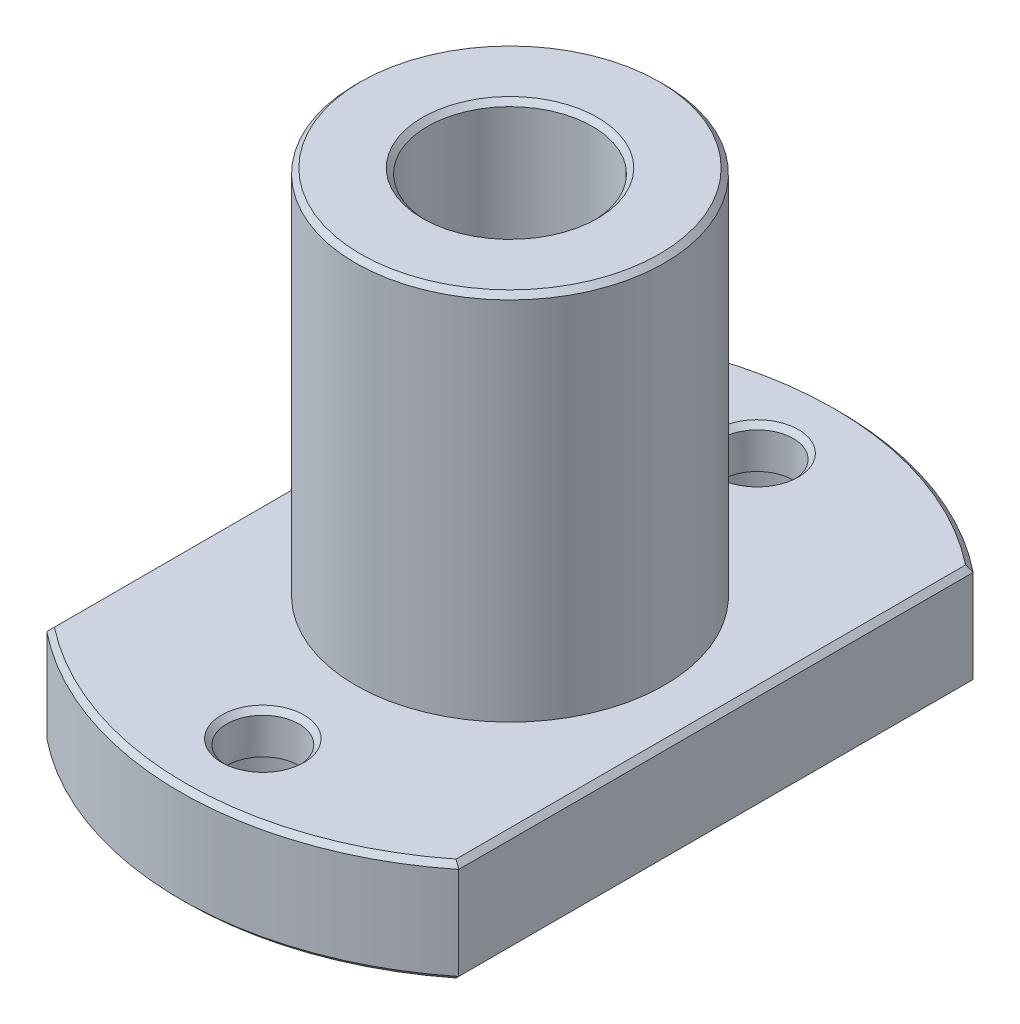
ISO-10303-21;
HEADER;
FILE_DESCRIPTION(('STEP AP214'),'2;1');
FILE_NAME('part.step','',(''),(''),'','','');
FILE_SCHEMA(('AUTOMOTIVE_DESIGN { 1 0 10303 214 1 1 1 1 }'));
ENDSEC;
DATA;
#1=APPLICATION_CONTEXT('core data for automotive mechanical design processes');
#2=APPLICATION_PROTOCOL_DEFINITION('international standard','automotive_design',2000,#1);
#3=PRODUCT_CONTEXT('',#1,'mechanical');
#4=PRODUCT('Part','Part','',(#3));
#5=PRODUCT_RELATED_PRODUCT_CATEGORY('part','',(#4));
#6=PRODUCT_DEFINITION_FORMATION('','',#4);
#7=PRODUCT_DEFINITION_CONTEXT('part definition',#1,'design');
#8=PRODUCT_DEFINITION('design','',#6,#7);
#9=PRODUCT_DEFINITION_SHAPE('','',#8);
#10=(LENGTH_UNIT() NAMED_UNIT(*) SI_UNIT(.MILLI.,.METRE.));
#11=(NAMED_UNIT(*) PLANE_ANGLE_UNIT() SI_UNIT($,.RADIAN.));
#12=(NAMED_UNIT(*) SI_UNIT($,.STERADIAN.) SOLID_ANGLE_UNIT());
#13=UNCERTAINTY_MEASURE_WITH_UNIT(LENGTH_MEASURE(1.E-05),#10,'distance_accuracy_value','');
#14=(GEOMETRIC_REPRESENTATION_CONTEXT(3) GLOBAL_UNCERTAINTY_ASSIGNED_CONTEXT((#13)) GLOBAL_UNIT_ASSIGNED_CONTEXT((#10,
#11,#12)) REPRESENTATION_CONTEXT('',''));
#15=CARTESIAN_POINT('',(0.,0.,0.));
#16=DIRECTION('',(0.,0.,1.));
#17=DIRECTION('',(1.,0.,0.));
#18=AXIS2_PLACEMENT_3D('',#15,#16,#17);
#19=CARTESIAN_POINT('',(0.,0.,-12.));
#20=DIRECTION('',(0.,1.,0.));
#21=DIRECTION('',(0.,0.,1.));
#22=AXIS2_PLACEMENT_3D('',#19,#20,#21);
#23=CYLINDRICAL_SURFACE('',#22,1.75);
#24=CARTESIAN_POINT('',(0.,4.74999999999999,-12.));
#25=DIRECTION('',(0.,1.,0.));
#26=DIRECTION('',(0.,0.,1.));
#27=AXIS2_PLACEMENT_3D('',#24,#25,#26);
#28=CIRCLE('',#27,1.75);
#29=CARTESIAN_POINT('',(0.,4.74999999999999,-10.25));
#30=VERTEX_POINT('',#29);
#31=EDGE_CURVE('E127',#30,#30,#28,.T.);
#32=ORIENTED_EDGE('',*,*,#31,.T.);
#33=EDGE_LOOP('',(#32));
#34=FACE_BOUND('',#33,.T.);
#35=CARTESIAN_POINT('',(0.,3.,-12.));
#36=DIRECTION('',(0.,-1.,0.));
#37=DIRECTION('',(0.,0.,-1.));
#38=AXIS2_PLACEMENT_3D('',#35,#36,#37);
#39=CIRCLE('',#38,1.75);
#40=CARTESIAN_POINT('',(0.,3.,-13.75));
#41=VERTEX_POINT('',#40);
#42=EDGE_CURVE('E279',#41,#41,#39,.F.);
#43=ORIENTED_EDGE('',*,*,#42,.F.);
#44=EDGE_LOOP('',(#43));
#45=FACE_BOUND('',#44,.T.);
#46=ADVANCED_FACE('F35',(#34,#45),#23,.F.);
#47=CARTESIAN_POINT('',(0.,0.,12.));
#48=DIRECTION('',(0.,1.,0.));
#49=DIRECTION('',(0.,0.,1.));
#50=AXIS2_PLACEMENT_3D('',#47,#48,#49);
#51=CYLINDRICAL_SURFACE('',#50,1.75);
#52=CARTESIAN_POINT('',(0.,4.74999999999998,12.));
#53=DIRECTION('',(0.,1.,0.));
#54=DIRECTION('',(0.,0.,1.));
#55=AXIS2_PLACEMENT_3D('',#52,#53,#54);
#56=CIRCLE('',#55,1.75);
#57=CARTESIAN_POINT('',(0.,4.74999999999998,13.75));
#58=VERTEX_POINT('',#57);
#59=EDGE_CURVE('E144',#58,#58,#56,.T.);
#60=ORIENTED_EDGE('',*,*,#59,.T.);
#61=EDGE_LOOP('',(#60));
#62=FACE_BOUND('',#61,.T.);
#63=CARTESIAN_POINT('',(0.,3.,12.));
#64=DIRECTION('',(0.,-1.,0.));
#65=DIRECTION('',(0.,0.,-1.));
#66=AXIS2_PLACEMENT_3D('',#63,#64,#65);
#67=CIRCLE('',#66,1.75);
#68=CARTESIAN_POINT('',(0.,3.,10.25));
#69=VERTEX_POINT('',#68);
#70=EDGE_CURVE('E275',#69,#69,#67,.F.);
#71=ORIENTED_EDGE('',*,*,#70,.F.);
#72=EDGE_LOOP('',(#71));
#73=FACE_BOUND('',#72,.T.);
#74=ADVANCED_FACE('F324',(#62,#73),#51,.F.);
#75=CARTESIAN_POINT('',(0.,5.,0.));
#76=DIRECTION('',(0.,-1.,0.));
#77=DIRECTION('',(0.,0.,-1.));
#78=AXIS2_PLACEMENT_3D('',#75,#76,#77);
#79=CYLINDRICAL_SURFACE('',#78,16.);
#80=DIRECTION('',(0.,-1.,0.));
#81=VECTOR('',#80,1.);
#82=CARTESIAN_POINT('',(-10.,5.,12.4899959967968));
#83=LINE('',#82,#81);
#84=CARTESIAN_POINT('',(-10.,4.74999999999999,12.4899959967968));
#85=VERTEX_POINT('',#84);
#86=CARTESIAN_POINT('',(-10.,0.250000000000004,12.4899959967968));
#87=VERTEX_POINT('',#86);
#88=EDGE_CURVE('E267',#85,#87,#83,.T.);
#89=ORIENTED_EDGE('',*,*,#88,.T.);
#90=CARTESIAN_POINT('',(0.,0.250000000000004,0.));
#91=DIRECTION('',(0.,1.,0.));
#92=DIRECTION('',(0.,0.,1.));
#93=AXIS2_PLACEMENT_3D('',#90,#91,#92);
#94=CIRCLE('',#93,16.);
#95=CARTESIAN_POINT('',(10.,0.250000000000004,12.4899959967968));
#96=VERTEX_POINT('',#95);
#97=EDGE_CURVE('E180',#87,#96,#94,.T.);
#98=ORIENTED_EDGE('',*,*,#97,.T.);
#99=DIRECTION('',(0.,-1.,0.));
#100=VECTOR('',#99,1.);
#101=CARTESIAN_POINT('',(10.,5.,12.4899959967968));
#102=LINE('',#101,#100);
#103=CARTESIAN_POINT('',(10.,4.74999999999999,12.4899959967968));
#104=VERTEX_POINT('',#103);
#105=EDGE_CURVE('E265',#104,#96,#102,.T.);
#106=ORIENTED_EDGE('',*,*,#105,.F.);
#107=CARTESIAN_POINT('',(0.,4.74999999999999,0.));
#108=DIRECTION('',(0.,1.,0.));
#109=DIRECTION('',(0.,0.,1.));
#110=AXIS2_PLACEMENT_3D('',#107,#108,#109);
#111=CIRCLE('',#110,16.);
#112=EDGE_CURVE('E62',#104,#85,#111,.F.);
#113=ORIENTED_EDGE('',*,*,#112,.T.);
#114=EDGE_LOOP('',(#89,#98,#106,#113));
#115=FACE_BOUND('',#114,.T.);
#116=ADVANCED_FACE('F296',(#115),#79,.T.);
#117=DIRECTION('',(0.,-1.,0.));
#118=VECTOR('',#117,1.);
#119=CARTESIAN_POINT('',(10.,5.,-12.4899959967968));
#120=LINE('',#119,#118);
#121=CARTESIAN_POINT('',(10.,4.74999999999999,-12.4899959967968));
#122=VERTEX_POINT('',#121);
#123=CARTESIAN_POINT('',(10.,0.250000000000004,-12.4899959967968));
#124=VERTEX_POINT('',#123);
#125=EDGE_CURVE('E261',#122,#124,#120,.T.);
#126=ORIENTED_EDGE('',*,*,#125,.T.);
#127=CARTESIAN_POINT('',(0.,0.250000000000004,0.));
#128=DIRECTION('',(0.,1.,0.));
#129=DIRECTION('',(0.,0.,1.));
#130=AXIS2_PLACEMENT_3D('',#127,#128,#129);
#131=CIRCLE('',#130,16.);
#132=CARTESIAN_POINT('',(-10.,0.250000000000004,-12.4899959967968));
#133=VERTEX_POINT('',#132);
#134=EDGE_CURVE('E177',#124,#133,#131,.T.);
#135=ORIENTED_EDGE('',*,*,#134,.T.);
#136=DIRECTION('',(0.,-1.,0.));
#137=VECTOR('',#136,1.);
#138=CARTESIAN_POINT('',(-10.,5.,-12.4899959967968));
#139=LINE('',#138,#137);
#140=CARTESIAN_POINT('',(-10.,4.74999999999999,-12.4899959967968));
#141=VERTEX_POINT('',#140);
#142=EDGE_CURVE('E262',#141,#133,#139,.T.);
#143=ORIENTED_EDGE('',*,*,#142,.F.);
#144=CARTESIAN_POINT('',(0.,4.74999999999999,0.));
#145=DIRECTION('',(0.,1.,0.));
#146=DIRECTION('',(0.,0.,1.));
#147=AXIS2_PLACEMENT_3D('',#144,#145,#146);
#148=CIRCLE('',#147,16.);
#149=EDGE_CURVE('E114',#141,#122,#148,.F.);
#150=ORIENTED_EDGE('',*,*,#149,.T.);
#151=EDGE_LOOP('',(#126,#135,#143,#150));
#152=FACE_BOUND('',#151,.T.);
#153=ADVANCED_FACE('F260',(#152),#79,.T.);
#154=CARTESIAN_POINT('',(0.,5.,0.));
#155=DIRECTION('',(0.,1.,0.));
#156=DIRECTION('',(0.,0.,1.));
#157=AXIS2_PLACEMENT_3D('',#154,#155,#156);
#158=PLANE('',#157);
#159=CARTESIAN_POINT('',(0.,5.,-12.));
#160=DIRECTION('',(0.,1.,0.));
#161=DIRECTION('',(0.,0.,1.));
#162=AXIS2_PLACEMENT_3D('',#159,#160,#161);
#163=CIRCLE('',#162,2.00000000000001);
#164=CARTESIAN_POINT('',(0.,5.,-9.99999999999999));
#165=VERTEX_POINT('',#164);
#166=EDGE_CURVE('E137',#165,#165,#163,.F.);
#167=ORIENTED_EDGE('',*,*,#166,.T.);
#168=EDGE_LOOP('',(#167));
#169=FACE_BOUND('',#168,.T.);
#170=CARTESIAN_POINT('',(0.,5.,12.));
#171=DIRECTION('',(0.,1.,0.));
#172=DIRECTION('',(0.,0.,1.));
#173=AXIS2_PLACEMENT_3D('',#170,#171,#172);
#174=CIRCLE('',#173,2.00000000000001);
#175=CARTESIAN_POINT('',(0.,5.,14.));
#176=VERTEX_POINT('',#175);
#177=EDGE_CURVE('E134',#176,#176,#174,.F.);
#178=ORIENTED_EDGE('',*,*,#177,.T.);
#179=EDGE_LOOP('',(#178));
#180=FACE_BOUND('',#179,.T.);
#181=DIRECTION('',(0.,0.,-1.));
#182=VECTOR('',#181,1.);
#183=CARTESIAN_POINT('',(9.74999999999999,5.,0.));
#184=LINE('',#183,#182);
#185=CARTESIAN_POINT('',(9.74999999999999,5.,12.369316876853));
#186=VERTEX_POINT('',#185);
#187=CARTESIAN_POINT('',(9.74999999999999,5.,-12.369316876853));
#188=VERTEX_POINT('',#187);
#189=EDGE_CURVE('E132',#186,#188,#184,.T.);
#190=ORIENTED_EDGE('',*,*,#189,.T.);
#191=CARTESIAN_POINT('',(0.,5.,0.));
#192=DIRECTION('',(0.,1.,0.));
#193=DIRECTION('',(0.,0.,1.));
#194=AXIS2_PLACEMENT_3D('',#191,#192,#193);
#195=CIRCLE('',#194,15.75);
#196=CARTESIAN_POINT('',(-9.74999999999999,5.,-12.369316876853));
#197=VERTEX_POINT('',#196);
#198=EDGE_CURVE('E112',#188,#197,#195,.T.);
#199=ORIENTED_EDGE('',*,*,#198,.T.);
#200=DIRECTION('',(0.,0.,1.));
#201=VECTOR('',#200,1.);
#202=CARTESIAN_POINT('',(-9.74999999999999,5.,0.));
#203=LINE('',#202,#201);
#204=CARTESIAN_POINT('',(-9.74999999999999,5.,12.369316876853));
#205=VERTEX_POINT('',#204);
#206=EDGE_CURVE('E120',#197,#205,#203,.T.);
#207=ORIENTED_EDGE('',*,*,#206,.T.);
#208=CARTESIAN_POINT('',(0.,5.,0.));
#209=DIRECTION('',(0.,1.,0.));
#210=DIRECTION('',(0.,0.,1.));
#211=AXIS2_PLACEMENT_3D('',#208,#209,#210);
#212=CIRCLE('',#211,15.75);
#213=EDGE_CURVE('E126',#205,#186,#212,.T.);
#214=ORIENTED_EDGE('',*,*,#213,.T.);
#215=EDGE_LOOP('',(#190,#199,#207,#214));
#216=FACE_BOUND('',#215,.T.);
#217=CARTESIAN_POINT('',(0.,5.,0.));
#218=DIRECTION('',(0.,1.,0.));
#219=DIRECTION('',(0.,0.,1.));
#220=AXIS2_PLACEMENT_3D('',#217,#218,#219);
#221=CIRCLE('',#220,7.5);
#222=CARTESIAN_POINT('',(0.,5.,7.5));
#223=VERTEX_POINT('',#222);
#224=EDGE_CURVE('E269',#223,#223,#221,.T.);
#225=ORIENTED_EDGE('',*,*,#224,.F.);
#226=EDGE_LOOP('',(#225));
#227=FACE_BOUND('',#226,.T.);
#228=ADVANCED_FACE('F129',(#169,#180,#216,#227),#158,.T.);
#229=CARTESIAN_POINT('',(0.,0.,0.));
#230=DIRECTION('',(0.,1.,0.));
#231=DIRECTION('',(0.,0.,1.));
#232=AXIS2_PLACEMENT_3D('',#229,#230,#231);
#233=PLANE('',#232);
#234=CARTESIAN_POINT('',(0.,0.,12.));
#235=DIRECTION('',(0.,1.,0.));
#236=DIRECTION('',(0.,0.,1.));
#237=AXIS2_PLACEMENT_3D('',#234,#235,#236);
#238=CIRCLE('',#237,3.25);
#239=CARTESIAN_POINT('',(0.,0.,15.25));
#240=VERTEX_POINT('',#239);
#241=EDGE_CURVE('E165',#240,#240,#238,.T.);
#242=ORIENTED_EDGE('',*,*,#241,.T.);
#243=EDGE_LOOP('',(#242));
#244=FACE_BOUND('',#243,.T.);
#245=CARTESIAN_POINT('',(0.,0.,0.));
#246=DIRECTION('',(0.,1.,0.));
#247=DIRECTION('',(0.,0.,1.));
#248=AXIS2_PLACEMENT_3D('',#245,#246,#247);
#249=CIRCLE('',#248,4.25);
#250=CARTESIAN_POINT('',(0.,0.,4.25));
#251=VERTEX_POINT('',#250);
#252=EDGE_CURVE('E162',#251,#251,#249,.T.);
#253=ORIENTED_EDGE('',*,*,#252,.T.);
#254=EDGE_LOOP('',(#253));
#255=FACE_BOUND('',#254,.T.);
#256=CARTESIAN_POINT('',(0.,0.,-12.));
#257=DIRECTION('',(0.,1.,0.));
#258=DIRECTION('',(0.,0.,1.));
#259=AXIS2_PLACEMENT_3D('',#256,#257,#258);
#260=CIRCLE('',#259,3.25);
#261=CARTESIAN_POINT('',(0.,0.,-8.75));
#262=VERTEX_POINT('',#261);
#263=EDGE_CURVE('E159',#262,#262,#260,.T.);
#264=ORIENTED_EDGE('',*,*,#263,.T.);
#265=EDGE_LOOP('',(#264));
#266=FACE_BOUND('',#265,.T.);
#267=CARTESIAN_POINT('',(0.,0.,0.));
#268=DIRECTION('',(0.,1.,0.));
#269=DIRECTION('',(0.,0.,1.));
#270=AXIS2_PLACEMENT_3D('',#267,#268,#269);
#271=CIRCLE('',#270,15.75);
#272=CARTESIAN_POINT('',(-9.75,0.,-12.369316876853));
#273=VERTEX_POINT('',#272);
#274=CARTESIAN_POINT('',(9.75,0.,-12.369316876853));
#275=VERTEX_POINT('',#274);
#276=EDGE_CURVE('E154',#273,#275,#271,.F.);
#277=ORIENTED_EDGE('',*,*,#276,.T.);
#278=DIRECTION('',(0.,0.,1.));
#279=VECTOR('',#278,1.);
#280=CARTESIAN_POINT('',(9.75,0.,12.4899959967968));
#281=LINE('',#280,#279);
#282=CARTESIAN_POINT('',(9.75,0.,12.369316876853));
#283=VERTEX_POINT('',#282);
#284=EDGE_CURVE('E156',#275,#283,#281,.T.);
#285=ORIENTED_EDGE('',*,*,#284,.T.);
#286=CARTESIAN_POINT('',(0.,0.,0.));
#287=DIRECTION('',(0.,1.,0.));
#288=DIRECTION('',(0.,0.,1.));
#289=AXIS2_PLACEMENT_3D('',#286,#287,#288);
#290=CIRCLE('',#289,15.75);
#291=CARTESIAN_POINT('',(-9.75,0.,12.369316876853));
#292=VERTEX_POINT('',#291);
#293=EDGE_CURVE('E152',#283,#292,#290,.F.);
#294=ORIENTED_EDGE('',*,*,#293,.T.);
#295=DIRECTION('',(0.,0.,-1.));
#296=VECTOR('',#295,1.);
#297=CARTESIAN_POINT('',(-9.75,0.,-12.4899959967968));
#298=LINE('',#297,#296);
#299=EDGE_CURVE('E150',#292,#273,#298,.T.);
#300=ORIENTED_EDGE('',*,*,#299,.T.);
#301=EDGE_LOOP('',(#277,#285,#294,#300));
#302=FACE_BOUND('',#301,.T.);
#303=ADVANCED_FACE('F310',(#244,#255,#266,#302),#233,.F.);
#304=CARTESIAN_POINT('',(-10.,5.,-12.4899959967968));
#305=DIRECTION('',(-1.,0.,0.));
#306=DIRECTION('',(0.,0.,1.));
#307=AXIS2_PLACEMENT_3D('',#304,#305,#306);
#308=PLANE('',#307);
#309=ORIENTED_EDGE('',*,*,#142,.T.);
#310=DIRECTION('',(0.,0.,1.));
#311=VECTOR('',#310,1.);
#312=CARTESIAN_POINT('',(-10.,0.250000000000004,12.4899959967968));
#313=LINE('',#312,#311);
#314=EDGE_CURVE('E48',#133,#87,#313,.T.);
#315=ORIENTED_EDGE('',*,*,#314,.T.);
#316=ORIENTED_EDGE('',*,*,#88,.F.);
#317=DIRECTION('',(0.,0.,-1.));
#318=VECTOR('',#317,1.);
#319=CARTESIAN_POINT('',(-10.,4.74999999999999,-12.4899959967968));
#320=LINE('',#319,#318);
#321=EDGE_CURVE('E182',#85,#141,#320,.T.);
#322=ORIENTED_EDGE('',*,*,#321,.T.);
#323=EDGE_LOOP('',(#309,#315,#316,#322));
#324=FACE_BOUND('',#323,.T.);
#325=ADVANCED_FACE('F294',(#324),#308,.T.);
#326=CARTESIAN_POINT('',(10.,5.,-12.4899959967968));
#327=DIRECTION('',(1.,0.,0.));
#328=DIRECTION('',(0.,0.,-1.));
#329=AXIS2_PLACEMENT_3D('',#326,#327,#328);
#330=PLANE('',#329);
#331=ORIENTED_EDGE('',*,*,#105,.T.);
#332=DIRECTION('',(0.,0.,-1.));
#333=VECTOR('',#332,1.);
#334=CARTESIAN_POINT('',(10.,0.250000000000004,-12.4899959967968));
#335=LINE('',#334,#333);
#336=EDGE_CURVE('E173',#96,#124,#335,.T.);
#337=ORIENTED_EDGE('',*,*,#336,.T.);
#338=ORIENTED_EDGE('',*,*,#125,.F.);
#339=DIRECTION('',(0.,0.,1.));
#340=VECTOR('',#339,1.);
#341=CARTESIAN_POINT('',(10.,4.74999999999999,-12.4899959967968));
#342=LINE('',#341,#340);
#343=EDGE_CURVE('E171',#122,#104,#342,.T.);
#344=ORIENTED_EDGE('',*,*,#343,.T.);
#345=EDGE_LOOP('',(#331,#337,#338,#344));
#346=FACE_BOUND('',#345,.T.);
#347=ADVANCED_FACE('F263',(#346),#330,.T.);
#348=CARTESIAN_POINT('',(0.,23.,0.));
#349=DIRECTION('',(0.,-1.,0.));
#350=DIRECTION('',(0.,0.,-1.));
#351=AXIS2_PLACEMENT_3D('',#348,#349,#350);
#352=CYLINDRICAL_SURFACE('',#351,7.5);
#353=CARTESIAN_POINT('',(0.,22.75,0.));
#354=DIRECTION('',(0.,1.,0.));
#355=DIRECTION('',(0.,0.,1.));
#356=AXIS2_PLACEMENT_3D('',#353,#354,#355);
#357=CIRCLE('',#356,7.5);
#358=CARTESIAN_POINT('',(0.,22.75,7.5));
#359=VERTEX_POINT('',#358);
#360=EDGE_CURVE('E11',#359,#359,#357,.F.);
#361=ORIENTED_EDGE('',*,*,#360,.T.);
#362=EDGE_LOOP('',(#361));
#363=FACE_BOUND('',#362,.T.);
#364=ORIENTED_EDGE('',*,*,#224,.T.);
#365=EDGE_LOOP('',(#364));
#366=FACE_BOUND('',#365,.T.);
#367=ADVANCED_FACE('F343',(#363,#366),#352,.T.);
#368=CARTESIAN_POINT('',(0.,23.,0.));
#369=DIRECTION('',(0.,1.,0.));
#370=DIRECTION('',(0.,0.,1.));
#371=AXIS2_PLACEMENT_3D('',#368,#369,#370);
#372=PLANE('',#371);
#373=CARTESIAN_POINT('',(0.,23.,0.));
#374=DIRECTION('',(0.,1.,0.));
#375=DIRECTION('',(0.,0.,1.));
#376=AXIS2_PLACEMENT_3D('',#373,#374,#375);
#377=CIRCLE('',#376,4.25000000000001);
#378=CARTESIAN_POINT('',(0.,23.,4.25000000000001));
#379=VERTEX_POINT('',#378);
#380=EDGE_CURVE('E290',#379,#379,#377,.F.);
#381=ORIENTED_EDGE('',*,*,#380,.T.);
#382=EDGE_LOOP('',(#381));
#383=FACE_BOUND('',#382,.T.);
#384=CARTESIAN_POINT('',(0.,23.,0.));
#385=DIRECTION('',(0.,1.,0.));
#386=DIRECTION('',(0.,0.,1.));
#387=AXIS2_PLACEMENT_3D('',#384,#385,#386);
#388=CIRCLE('',#387,7.25);
#389=CARTESIAN_POINT('',(0.,23.,7.25));
#390=VERTEX_POINT('',#389);
#391=EDGE_CURVE('E287',#390,#390,#388,.T.);
#392=ORIENTED_EDGE('',*,*,#391,.T.);
#393=EDGE_LOOP('',(#392));
#394=FACE_BOUND('',#393,.T.);
#395=ADVANCED_FACE('F339',(#383,#394),#372,.T.);
#396=CARTESIAN_POINT('',(0.,0.,0.));
#397=DIRECTION('',(0.,1.,0.));
#398=DIRECTION('',(0.,0.,1.));
#399=AXIS2_PLACEMENT_3D('',#396,#397,#398);
#400=CYLINDRICAL_SURFACE('',#399,4.);
#401=CARTESIAN_POINT('',(0.,22.75,0.));
#402=DIRECTION('',(0.,1.,0.));
#403=DIRECTION('',(0.,0.,1.));
#404=AXIS2_PLACEMENT_3D('',#401,#402,#403);
#405=CIRCLE('',#404,4.);
#406=CARTESIAN_POINT('',(0.,22.75,4.));
#407=VERTEX_POINT('',#406);
#408=EDGE_CURVE('E284',#407,#407,#405,.T.);
#409=ORIENTED_EDGE('',*,*,#408,.T.);
#410=EDGE_LOOP('',(#409));
#411=FACE_BOUND('',#410,.T.);
#412=CARTESIAN_POINT('',(0.,0.25,0.));
#413=DIRECTION('',(0.,1.,0.));
#414=DIRECTION('',(0.,0.,1.));
#415=AXIS2_PLACEMENT_3D('',#412,#413,#414);
#416=CIRCLE('',#415,4.);
#417=CARTESIAN_POINT('',(0.,0.25,4.));
#418=VERTEX_POINT('',#417);
#419=EDGE_CURVE('E274',#418,#418,#416,.F.);
#420=ORIENTED_EDGE('',*,*,#419,.T.);
#421=EDGE_LOOP('',(#420));
#422=FACE_BOUND('',#421,.T.);
#423=ADVANCED_FACE('F335',(#411,#422),#400,.F.);
#424=CARTESIAN_POINT('',(0.,3.,12.));
#425=DIRECTION('',(0.,-1.,0.));
#426=DIRECTION('',(0.,0.,-1.));
#427=AXIS2_PLACEMENT_3D('',#424,#425,#426);
#428=PLANE('',#427);
#429=CARTESIAN_POINT('',(0.,3.,12.));
#430=DIRECTION('',(0.,-1.,0.));
#431=DIRECTION('',(0.,0.,-1.));
#432=AXIS2_PLACEMENT_3D('',#429,#430,#431);
#433=CIRCLE('',#432,3.);
#434=CARTESIAN_POINT('',(0.,3.,9.));
#435=VERTEX_POINT('',#434);
#436=EDGE_CURVE('E278',#435,#435,#433,.T.);
#437=ORIENTED_EDGE('',*,*,#436,.T.);
#438=EDGE_LOOP('',(#437));
#439=FACE_BOUND('',#438,.T.);
#440=ORIENTED_EDGE('',*,*,#70,.T.);
#441=EDGE_LOOP('',(#440));
#442=FACE_BOUND('',#441,.T.);
#443=ADVANCED_FACE('F338',(#439,#442),#428,.T.);
#444=CARTESIAN_POINT('',(0.,3.,12.));
#445=DIRECTION('',(0.,-1.,0.));
#446=DIRECTION('',(0.,0.,-1.));
#447=AXIS2_PLACEMENT_3D('',#444,#445,#446);
#448=CYLINDRICAL_SURFACE('',#447,3.);
#449=CARTESIAN_POINT('',(0.,0.249999999999999,12.));
#450=DIRECTION('',(0.,1.,0.));
#451=DIRECTION('',(0.,0.,1.));
#452=AXIS2_PLACEMENT_3D('',#449,#450,#451);
#453=CIRCLE('',#452,3.);
#454=CARTESIAN_POINT('',(0.,0.249999999999999,15.));
#455=VERTEX_POINT('',#454);
#456=EDGE_CURVE('E147',#455,#455,#453,.F.);
#457=ORIENTED_EDGE('',*,*,#456,.T.);
#458=EDGE_LOOP('',(#457));
#459=FACE_BOUND('',#458,.T.);
#460=ORIENTED_EDGE('',*,*,#436,.F.);
#461=EDGE_LOOP('',(#460));
#462=FACE_BOUND('',#461,.T.);
#463=ADVANCED_FACE('F372',(#459,#462),#448,.F.);
#464=CARTESIAN_POINT('',(0.,3.,-12.));
#465=DIRECTION('',(0.,-1.,0.));
#466=DIRECTION('',(0.,0.,-1.));
#467=AXIS2_PLACEMENT_3D('',#464,#465,#466);
#468=PLANE('',#467);
#469=CARTESIAN_POINT('',(0.,3.,-12.));
#470=DIRECTION('',(0.,-1.,0.));
#471=DIRECTION('',(0.,0.,-1.));
#472=AXIS2_PLACEMENT_3D('',#469,#470,#471);
#473=CIRCLE('',#472,3.);
#474=CARTESIAN_POINT('',(0.,3.,-15.));
#475=VERTEX_POINT('',#474);
#476=EDGE_CURVE('E222',#475,#475,#473,.T.);
#477=ORIENTED_EDGE('',*,*,#476,.T.);
#478=EDGE_LOOP('',(#477));
#479=FACE_BOUND('',#478,.T.);
#480=ORIENTED_EDGE('',*,*,#42,.T.);
#481=EDGE_LOOP('',(#480));
#482=FACE_BOUND('',#481,.T.);
#483=ADVANCED_FACE('F380',(#479,#482),#468,.T.);
#484=CARTESIAN_POINT('',(0.,3.,-12.));
#485=DIRECTION('',(0.,-1.,0.));
#486=DIRECTION('',(0.,0.,-1.));
#487=AXIS2_PLACEMENT_3D('',#484,#485,#486);
#488=CYLINDRICAL_SURFACE('',#487,3.);
#489=CARTESIAN_POINT('',(0.,0.249999999999999,-12.));
#490=DIRECTION('',(0.,1.,0.));
#491=DIRECTION('',(0.,0.,1.));
#492=AXIS2_PLACEMENT_3D('',#489,#490,#491);
#493=CIRCLE('',#492,3.);
#494=CARTESIAN_POINT('',(0.,0.249999999999999,-9.));
#495=VERTEX_POINT('',#494);
#496=EDGE_CURVE('E168',#495,#495,#493,.F.);
#497=ORIENTED_EDGE('',*,*,#496,.T.);
#498=EDGE_LOOP('',(#497));
#499=FACE_BOUND('',#498,.T.);
#500=ORIENTED_EDGE('',*,*,#476,.F.);
#501=EDGE_LOOP('',(#500));
#502=FACE_BOUND('',#501,.T.);
#503=ADVANCED_FACE('F387',(#499,#502),#488,.F.);
#504=CARTESIAN_POINT('',(0.,22.75,0.));
#505=DIRECTION('',(0.,1.,0.));
#506=DIRECTION('',(0.,0.,1.));
#507=AXIS2_PLACEMENT_3D('',#504,#505,#506);
#508=CONICAL_SURFACE('',#507,4.,0.785398163397462);
#509=ORIENTED_EDGE('',*,*,#380,.F.);
#510=EDGE_LOOP('',(#509));
#511=FACE_BOUND('',#510,.T.);
#512=ORIENTED_EDGE('',*,*,#408,.F.);
#513=EDGE_LOOP('',(#512));
#514=FACE_BOUND('',#513,.T.);
#515=ADVANCED_FACE('F394',(#511,#514),#508,.F.);
#516=CARTESIAN_POINT('',(0.,4.74999999999999,-12.));
#517=DIRECTION('',(0.,1.,0.));
#518=DIRECTION('',(0.,0.,1.));
#519=AXIS2_PLACEMENT_3D('',#516,#517,#518);
#520=CONICAL_SURFACE('',#519,1.75,0.785398163397437);
#521=ORIENTED_EDGE('',*,*,#166,.F.);
#522=EDGE_LOOP('',(#521));
#523=FACE_BOUND('',#522,.T.);
#524=ORIENTED_EDGE('',*,*,#31,.F.);
#525=EDGE_LOOP('',(#524));
#526=FACE_BOUND('',#525,.T.);
#527=ADVANCED_FACE('F402',(#523,#526),#520,.F.);
#528=CARTESIAN_POINT('',(0.,4.74999999999998,12.));
#529=DIRECTION('',(0.,1.,0.));
#530=DIRECTION('',(0.,0.,1.));
#531=AXIS2_PLACEMENT_3D('',#528,#529,#530);
#532=CONICAL_SURFACE('',#531,1.75,0.785398163397437);
#533=ORIENTED_EDGE('',*,*,#177,.F.);
#534=EDGE_LOOP('',(#533));
#535=FACE_BOUND('',#534,.T.);
#536=ORIENTED_EDGE('',*,*,#59,.F.);
#537=EDGE_LOOP('',(#536));
#538=FACE_BOUND('',#537,.T.);
#539=ADVANCED_FACE('F410',(#535,#538),#532,.F.);
#540=CARTESIAN_POINT('',(0.,0.249999999999999,12.));
#541=DIRECTION('',(0.,-1.,0.));
#542=DIRECTION('',(0.,0.,-1.));
#543=AXIS2_PLACEMENT_3D('',#540,#541,#542);
#544=CONICAL_SURFACE('',#543,3.,0.785398163397451);
#545=ORIENTED_EDGE('',*,*,#241,.F.);
#546=EDGE_LOOP('',(#545));
#547=FACE_BOUND('',#546,.T.);
#548=ORIENTED_EDGE('',*,*,#456,.F.);
#549=EDGE_LOOP('',(#548));
#550=FACE_BOUND('',#549,.T.);
#551=ADVANCED_FACE('F418',(#547,#550),#544,.F.);
#552=CARTESIAN_POINT('',(0.,0.,0.));
#553=DIRECTION('',(0.,-1.,0.));
#554=DIRECTION('',(0.,0.,-1.));
#555=AXIS2_PLACEMENT_3D('',#552,#553,#554);
#556=CONICAL_SURFACE('',#555,4.25,0.785398163397441);
#557=ORIENTED_EDGE('',*,*,#419,.F.);
#558=EDGE_LOOP('',(#557));
#559=FACE_BOUND('',#558,.T.);
#560=ORIENTED_EDGE('',*,*,#252,.F.);
#561=EDGE_LOOP('',(#560));
#562=FACE_BOUND('',#561,.T.);
#563=ADVANCED_FACE('F426',(#559,#562),#556,.F.);
#564=CARTESIAN_POINT('',(0.,0.249999999999999,-12.));
#565=DIRECTION('',(0.,-1.,0.));
#566=DIRECTION('',(0.,0.,-1.));
#567=AXIS2_PLACEMENT_3D('',#564,#565,#566);
#568=CONICAL_SURFACE('',#567,3.,0.785398163397451);
#569=ORIENTED_EDGE('',*,*,#263,.F.);
#570=EDGE_LOOP('',(#569));
#571=FACE_BOUND('',#570,.T.);
#572=ORIENTED_EDGE('',*,*,#496,.F.);
#573=EDGE_LOOP('',(#572));
#574=FACE_BOUND('',#573,.T.);
#575=ADVANCED_FACE('F434',(#571,#574),#568,.F.);
#576=CARTESIAN_POINT('',(-9.75,0.,0.));
#577=DIRECTION('',(-0.707106781186547,-0.707106781186547,0.));
#578=DIRECTION('',(0.,0.,1.));
#579=AXIS2_PLACEMENT_3D('',#576,#577,#578);
#580=PLANE('',#579);
#581=CARTESIAN_POINT('',(-9.75,0.,12.369316876853));
#582=CARTESIAN_POINT('',(-9.79164555998661,0.041645559986615,12.3895175139398));
#583=CARTESIAN_POINT('',(-9.83330167340362,0.0833016734036281,12.4096744258553));
#584=CARTESIAN_POINT('',(-9.91663500673714,0.166635006737146,12.4499007991692));
#585=CARTESIAN_POINT('',(-9.95831222665346,0.208312226653467,12.4699702605683));
#586=CARTESIAN_POINT('',(-10.,0.250000000000004,12.4899959967968));
#587=B_SPLINE_CURVE_WITH_KNOTS('',3,(#581,#582,#583,#584,#585,#586),.UNSPECIFIED.,.F.,.F.,(4,2,
4),(0.,0.186791011592949,0.373582021566176),.UNSPECIFIED.);
#588=EDGE_CURVE('E223',#87,#292,#587,.F.);
#589=ORIENTED_EDGE('',*,*,#588,.F.);
#590=ORIENTED_EDGE('',*,*,#314,.F.);
#591=CARTESIAN_POINT('',(-10.,0.250000000000004,-12.4899959967968));
#592=CARTESIAN_POINT('',(-9.95831222665346,0.208312226653466,-12.4699702605683));
#593=CARTESIAN_POINT('',(-9.91663500673714,0.166635006737145,-12.4499007991692));
#594=CARTESIAN_POINT('',(-9.83330167340362,0.083301673403627,-12.4096744258553));
#595=CARTESIAN_POINT('',(-9.79164555998661,0.0416455599866143,-12.3895175139398));
#596=CARTESIAN_POINT('',(-9.75,0.,-12.369316876853));
#597=B_SPLINE_CURVE_WITH_KNOTS('',3,(#591,#592,#593,#594,#595,#596),.UNSPECIFIED.,.F.,.F.,(4,2,
4),(0.,0.186791009973226,0.373582021566176),.UNSPECIFIED.);
#598=EDGE_CURVE('E217',#273,#133,#597,.F.);
#599=ORIENTED_EDGE('',*,*,#598,.F.);
#600=ORIENTED_EDGE('',*,*,#299,.F.);
#601=EDGE_LOOP('',(#589,#590,#599,#600));
#602=FACE_BOUND('',#601,.T.);
#603=ADVANCED_FACE('F211',(#602),#580,.T.);
#604=CARTESIAN_POINT('',(0.,0.250000000000004,0.));
#605=DIRECTION('',(0.,1.,0.));
#606=DIRECTION('',(0.,0.,1.));
#607=AXIS2_PLACEMENT_3D('',#604,#605,#606);
#608=CONICAL_SURFACE('',#607,16.,0.785398163397448);
#609=ORIENTED_EDGE('',*,*,#598,.T.);
#610=ORIENTED_EDGE('',*,*,#134,.F.);
#611=CARTESIAN_POINT('',(10.,0.250000000000004,-12.4899959967968));
#612=CARTESIAN_POINT('',(9.95831222665346,0.208312226653466,-12.4699702605683));
#613=CARTESIAN_POINT('',(9.91663500673714,0.166635006737145,-12.4499007991692));
#614=CARTESIAN_POINT('',(9.83330167340362,0.083301673403627,-12.4096744258553));
#615=CARTESIAN_POINT('',(9.79164555998661,0.0416455599866143,-12.3895175139398));
#616=CARTESIAN_POINT('',(9.75,0.,-12.369316876853));
#617=B_SPLINE_CURVE_WITH_KNOTS('',3,(#611,#612,#613,#614,#615,#616),.UNSPECIFIED.,.F.,.F.,(4,2,
4),(0.,0.186791009973226,0.373582021566176),.UNSPECIFIED.);
#618=EDGE_CURVE('E192',#275,#124,#617,.F.);
#619=ORIENTED_EDGE('',*,*,#618,.F.);
#620=ORIENTED_EDGE('',*,*,#276,.F.);
#621=EDGE_LOOP('',(#609,#610,#619,#620));
#622=FACE_BOUND('',#621,.T.);
#623=ADVANCED_FACE('F206',(#622),#608,.T.);
#624=CARTESIAN_POINT('',(0.,0.250000000000004,0.));
#625=DIRECTION('',(0.,1.,0.));
#626=DIRECTION('',(0.,0.,1.));
#627=AXIS2_PLACEMENT_3D('',#624,#625,#626);
#628=CONICAL_SURFACE('',#627,16.,0.785398163397448);
#629=ORIENTED_EDGE('',*,*,#588,.T.);
#630=ORIENTED_EDGE('',*,*,#293,.F.);
#631=CARTESIAN_POINT('',(9.75,0.,12.369316876853));
#632=CARTESIAN_POINT('',(9.79164555998661,0.041645559986615,12.3895175139398));
#633=CARTESIAN_POINT('',(9.83330167340362,0.0833016734036281,12.4096744258553));
#634=CARTESIAN_POINT('',(9.91663500673714,0.166635006737146,12.4499007991692));
#635=CARTESIAN_POINT('',(9.95831222665346,0.208312226653467,12.4699702605683));
#636=CARTESIAN_POINT('',(10.,0.250000000000004,12.4899959967968));
#637=B_SPLINE_CURVE_WITH_KNOTS('',3,(#631,#632,#633,#634,#635,#636),.UNSPECIFIED.,.F.,.F.,(4,2,
4),(0.,0.186791011592949,0.373582021566176),.UNSPECIFIED.);
#638=EDGE_CURVE('E185',#96,#283,#637,.F.);
#639=ORIENTED_EDGE('',*,*,#638,.F.);
#640=ORIENTED_EDGE('',*,*,#97,.F.);
#641=EDGE_LOOP('',(#629,#630,#639,#640));
#642=FACE_BOUND('',#641,.T.);
#643=ADVANCED_FACE('F198',(#642),#628,.T.);
#644=CARTESIAN_POINT('',(9.75,0.,0.));
#645=DIRECTION('',(0.707106781186547,-0.707106781186547,0.));
#646=DIRECTION('',(0.,0.,-1.));
#647=AXIS2_PLACEMENT_3D('',#644,#645,#646);
#648=PLANE('',#647);
#649=ORIENTED_EDGE('',*,*,#618,.T.);
#650=ORIENTED_EDGE('',*,*,#336,.F.);
#651=ORIENTED_EDGE('',*,*,#638,.T.);
#652=ORIENTED_EDGE('',*,*,#284,.F.);
#653=EDGE_LOOP('',(#649,#650,#651,#652));
#654=FACE_BOUND('',#653,.T.);
#655=ADVANCED_FACE('F201',(#654),#648,.T.);
#656=CARTESIAN_POINT('',(0.,5.,0.));
#657=DIRECTION('',(0.,-1.,0.));
#658=DIRECTION('',(0.,0.,-1.));
#659=AXIS2_PLACEMENT_3D('',#656,#657,#658);
#660=CONICAL_SURFACE('',#659,15.75,0.785398163397448);
#661=CARTESIAN_POINT('',(-10.,4.74999999999999,12.4899959967968));
#662=CARTESIAN_POINT('',(-9.95831222665346,4.79168777334653,12.4699702605683));
#663=CARTESIAN_POINT('',(-9.91663500673714,4.83336499326285,12.4499007991692));
#664=CARTESIAN_POINT('',(-9.83330167340362,4.91669832659637,12.4096744258553));
#665=CARTESIAN_POINT('',(-9.79164555998661,4.95835444001338,12.3895175139398));
#666=CARTESIAN_POINT('',(-9.74999999999999,5.,12.369316876853));
#667=B_SPLINE_CURVE_WITH_KNOTS('',3,(#661,#662,#663,#664,#665,#666),.UNSPECIFIED.,.F.,.F.,(4,2,
4),(0.,0.186791009973229,0.37358202156618),.UNSPECIFIED.);
#668=EDGE_CURVE('E123',#85,#205,#667,.T.);
#669=ORIENTED_EDGE('',*,*,#668,.F.);
#670=ORIENTED_EDGE('',*,*,#112,.F.);
#671=CARTESIAN_POINT('',(10.,4.74999999999999,12.4899959967968));
#672=CARTESIAN_POINT('',(9.95831222665346,4.79168777334653,12.4699702605683));
#673=CARTESIAN_POINT('',(9.91663500673714,4.83336499326285,12.4499007991692));
#674=CARTESIAN_POINT('',(9.83330167340362,4.91669832659637,12.4096744258553));
#675=CARTESIAN_POINT('',(9.79164555998661,4.95835444001338,12.3895175139398));
#676=CARTESIAN_POINT('',(9.74999999999999,5.,12.369316876853));
#677=B_SPLINE_CURVE_WITH_KNOTS('',3,(#671,#672,#673,#674,#675,#676),.UNSPECIFIED.,.F.,.F.,(4,2,
4),(0.,0.186791009973229,0.37358202156618),.UNSPECIFIED.);
#678=EDGE_CURVE('E39',#186,#104,#677,.F.);
#679=ORIENTED_EDGE('',*,*,#678,.F.);
#680=ORIENTED_EDGE('',*,*,#213,.F.);
#681=EDGE_LOOP('',(#669,#670,#679,#680));
#682=FACE_BOUND('',#681,.T.);
#683=ADVANCED_FACE('F204',(#682),#660,.T.);
#684=CARTESIAN_POINT('',(10.,4.74999999999999,-12.4899959967968));
#685=DIRECTION('',(-0.707106781186548,-0.707106781186548,0.));
#686=DIRECTION('',(0.,0.,1.));
#687=AXIS2_PLACEMENT_3D('',#684,#685,#686);
#688=PLANE('',#687);
#689=ORIENTED_EDGE('',*,*,#678,.T.);
#690=ORIENTED_EDGE('',*,*,#343,.F.);
#691=CARTESIAN_POINT('',(10.,4.74999999999999,-12.4899959967968));
#692=CARTESIAN_POINT('',(9.95831222665346,4.79168777334653,-12.4699702605683));
#693=CARTESIAN_POINT('',(9.91663500673714,4.83336499326285,-12.4499007991692));
#694=CARTESIAN_POINT('',(9.83330167340362,4.91669832659637,-12.4096744258553));
#695=CARTESIAN_POINT('',(9.79164555998661,4.95835444001338,-12.3895175139398));
#696=CARTESIAN_POINT('',(9.74999999999999,5.,-12.369316876853));
#697=B_SPLINE_CURVE_WITH_KNOTS('',3,(#691,#692,#693,#694,#695,#696),.UNSPECIFIED.,.F.,.F.,(4,2,
4),(0.,0.186791009973229,0.37358202156618),.UNSPECIFIED.);
#698=EDGE_CURVE('E117',#188,#122,#697,.F.);
#699=ORIENTED_EDGE('',*,*,#698,.F.);
#700=ORIENTED_EDGE('',*,*,#189,.F.);
#701=EDGE_LOOP('',(#689,#690,#699,#700));
#702=FACE_BOUND('',#701,.T.);
#703=ADVANCED_FACE('F238',(#702),#688,.F.);
#704=CARTESIAN_POINT('',(-10.,4.74999999999999,-12.4899959967968));
#705=DIRECTION('',(0.707106781186548,-0.707106781186548,0.));
#706=DIRECTION('',(0.,0.,-1.));
#707=AXIS2_PLACEMENT_3D('',#704,#705,#706);
#708=PLANE('',#707);
#709=ORIENTED_EDGE('',*,*,#668,.T.);
#710=ORIENTED_EDGE('',*,*,#206,.F.);
#711=CARTESIAN_POINT('',(-9.74999999999999,5.,-12.369316876853));
#712=CARTESIAN_POINT('',(-9.79164555998661,4.95835444001338,-12.3895175139398));
#713=CARTESIAN_POINT('',(-9.83330167340362,4.91669832659637,-12.4096744258553));
#714=CARTESIAN_POINT('',(-9.91663500673714,4.83336499326285,-12.4499007991692));
#715=CARTESIAN_POINT('',(-9.95831222665346,4.79168777334653,-12.4699702605683));
#716=CARTESIAN_POINT('',(-10.,4.74999999999999,-12.4899959967968));
#717=B_SPLINE_CURVE_WITH_KNOTS('',3,(#711,#712,#713,#714,#715,#716),.UNSPECIFIED.,.F.,.F.,(4,2,
4),(0.,0.186791011592952,0.373582021566181),.UNSPECIFIED.);
#718=EDGE_CURVE('E108',#141,#197,#717,.F.);
#719=ORIENTED_EDGE('',*,*,#718,.F.);
#720=ORIENTED_EDGE('',*,*,#321,.F.);
#721=EDGE_LOOP('',(#709,#710,#719,#720));
#722=FACE_BOUND('',#721,.T.);
#723=ADVANCED_FACE('F121',(#722),#708,.F.);
#724=CARTESIAN_POINT('',(0.,5.,0.));
#725=DIRECTION('',(0.,-1.,0.));
#726=DIRECTION('',(0.,0.,-1.));
#727=AXIS2_PLACEMENT_3D('',#724,#725,#726);
#728=CONICAL_SURFACE('',#727,15.75,0.785398163397448);
#729=ORIENTED_EDGE('',*,*,#698,.T.);
#730=ORIENTED_EDGE('',*,*,#149,.F.);
#731=ORIENTED_EDGE('',*,*,#718,.T.);
#732=ORIENTED_EDGE('',*,*,#198,.F.);
#733=EDGE_LOOP('',(#729,#730,#731,#732));
#734=FACE_BOUND('',#733,.T.);
#735=ADVANCED_FACE('F110',(#734),#728,.T.);
#736=CARTESIAN_POINT('',(0.,23.,0.));
#737=DIRECTION('',(0.,-1.,0.));
#738=DIRECTION('',(0.,0.,-1.));
#739=AXIS2_PLACEMENT_3D('',#736,#737,#738);
#740=CONICAL_SURFACE('',#739,7.25,0.785398163397443);
#741=ORIENTED_EDGE('',*,*,#360,.F.);
#742=EDGE_LOOP('',(#741));
#743=FACE_BOUND('',#742,.T.);
#744=ORIENTED_EDGE('',*,*,#391,.F.);
#745=EDGE_LOOP('',(#744));
#746=FACE_BOUND('',#745,.T.);
#747=ADVANCED_FACE('F37',(#743,#746),#740,.T.);
#748=CLOSED_SHELL('',(#46,#74,#116,#153,#228,#303,#325,#347,#367,#395,#423,#443,#463,#483,#503,
#515,#527,#539,#551,#563,#575,#603,#623,#643,#655,#683,#703,#723,#735,#747));
#749=MANIFOLD_SOLID_BREP('B2',#748);
#750=ADVANCED_BREP_SHAPE_REPRESENTATION('',(#18,#749),#14);
#751=SHAPE_DEFINITION_REPRESENTATION(#9,#750);
ENDSEC;
END-ISO-10303-21;
